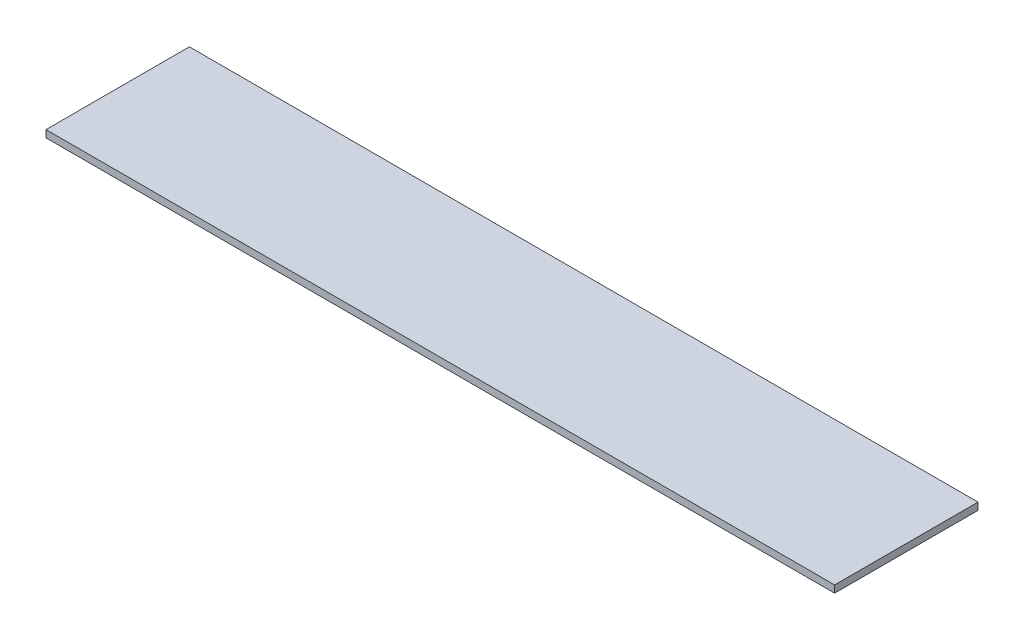
ISO-10303-21;
HEADER;
FILE_DESCRIPTION(('STEP AP214'),'2;1');
FILE_NAME('part.step','',(''),(''),'','','');
FILE_SCHEMA(('AUTOMOTIVE_DESIGN { 1 0 10303 214 1 1 1 1 }'));
ENDSEC;
DATA;
#1=APPLICATION_CONTEXT('core data for automotive mechanical design processes');
#2=APPLICATION_PROTOCOL_DEFINITION('international standard','automotive_design',2000,#1);
#3=PRODUCT_CONTEXT('',#1,'mechanical');
#4=PRODUCT('Part','Part','',(#3));
#5=PRODUCT_RELATED_PRODUCT_CATEGORY('part','',(#4));
#6=PRODUCT_DEFINITION_FORMATION('','',#4);
#7=PRODUCT_DEFINITION_CONTEXT('part definition',#1,'design');
#8=PRODUCT_DEFINITION('design','',#6,#7);
#9=PRODUCT_DEFINITION_SHAPE('','',#8);
#10=(LENGTH_UNIT() NAMED_UNIT(*) SI_UNIT(.MILLI.,.METRE.));
#11=(NAMED_UNIT(*) PLANE_ANGLE_UNIT() SI_UNIT($,.RADIAN.));
#12=(NAMED_UNIT(*) SI_UNIT($,.STERADIAN.) SOLID_ANGLE_UNIT());
#13=UNCERTAINTY_MEASURE_WITH_UNIT(LENGTH_MEASURE(1.E-05),#10,'distance_accuracy_value','');
#14=(GEOMETRIC_REPRESENTATION_CONTEXT(3) GLOBAL_UNCERTAINTY_ASSIGNED_CONTEXT((#13)) GLOBAL_UNIT_ASSIGNED_CONTEXT((#10,
#11,#12)) REPRESENTATION_CONTEXT('',''));
#15=CARTESIAN_POINT('',(0.,0.,0.));
#16=DIRECTION('',(0.,0.,1.));
#17=DIRECTION('',(1.,0.,0.));
#18=AXIS2_PLACEMENT_3D('',#15,#16,#17);
#19=CARTESIAN_POINT('',(0.,1.,0.));
#20=DIRECTION('',(1.,0.,0.));
#21=DIRECTION('',(0.,0.,-1.));
#22=AXIS2_PLACEMENT_3D('',#19,#20,#21);
#23=PLANE('',#22);
#24=DIRECTION('',(0.,0.,1.));
#25=VECTOR('',#24,1.);
#26=CARTESIAN_POINT('',(0.,0.,0.));
#27=LINE('',#26,#25);
#28=CARTESIAN_POINT('',(0.,0.,-20.));
#29=VERTEX_POINT('',#28);
#30=CARTESIAN_POINT('',(0.,0.,0.));
#31=VERTEX_POINT('',#30);
#32=EDGE_CURVE('E106',#29,#31,#27,.T.);
#33=ORIENTED_EDGE('',*,*,#32,.T.);
#34=DIRECTION('',(0.,-1.,0.));
#35=VECTOR('',#34,1.);
#36=CARTESIAN_POINT('',(0.,1.,0.));
#37=LINE('',#36,#35);
#38=CARTESIAN_POINT('',(0.,1.,0.));
#39=VERTEX_POINT('',#38);
#40=EDGE_CURVE('E11',#39,#31,#37,.T.);
#41=ORIENTED_EDGE('',*,*,#40,.F.);
#42=DIRECTION('',(0.,0.,1.));
#43=VECTOR('',#42,1.);
#44=CARTESIAN_POINT('',(0.,1.,0.));
#45=LINE('',#44,#43);
#46=CARTESIAN_POINT('',(0.,1.,-20.));
#47=VERTEX_POINT('',#46);
#48=EDGE_CURVE('E92',#47,#39,#45,.T.);
#49=ORIENTED_EDGE('',*,*,#48,.F.);
#50=DIRECTION('',(0.,-1.,0.));
#51=VECTOR('',#50,1.);
#52=CARTESIAN_POINT('',(0.,1.,-20.));
#53=LINE('',#52,#51);
#54=EDGE_CURVE('E105',#47,#29,#53,.T.);
#55=ORIENTED_EDGE('',*,*,#54,.T.);
#56=EDGE_LOOP('',(#33,#41,#49,#55));
#57=FACE_BOUND('',#56,.T.);
#58=ADVANCED_FACE('F43',(#57),#23,.F.);
#59=CARTESIAN_POINT('',(0.,1.,0.));
#60=DIRECTION('',(0.,0.,-1.));
#61=DIRECTION('',(-1.,0.,0.));
#62=AXIS2_PLACEMENT_3D('',#59,#60,#61);
#63=PLANE('',#62);
#64=DIRECTION('',(1.,0.,0.));
#65=VECTOR('',#64,1.);
#66=CARTESIAN_POINT('',(0.,0.,0.));
#67=LINE('',#66,#65);
#68=CARTESIAN_POINT('',(110.,0.,0.));
#69=VERTEX_POINT('',#68);
#70=EDGE_CURVE('E97',#31,#69,#67,.T.);
#71=ORIENTED_EDGE('',*,*,#70,.T.);
#72=DIRECTION('',(0.,-1.,0.));
#73=VECTOR('',#72,1.);
#74=CARTESIAN_POINT('',(110.,1.,0.));
#75=LINE('',#74,#73);
#76=CARTESIAN_POINT('',(110.,1.,0.));
#77=VERTEX_POINT('',#76);
#78=EDGE_CURVE('E51',#77,#69,#75,.T.);
#79=ORIENTED_EDGE('',*,*,#78,.F.);
#80=DIRECTION('',(1.,0.,0.));
#81=VECTOR('',#80,1.);
#82=CARTESIAN_POINT('',(0.,1.,0.));
#83=LINE('',#82,#81);
#84=EDGE_CURVE('E87',#39,#77,#83,.T.);
#85=ORIENTED_EDGE('',*,*,#84,.F.);
#86=ORIENTED_EDGE('',*,*,#40,.T.);
#87=EDGE_LOOP('',(#71,#79,#85,#86));
#88=FACE_BOUND('',#87,.T.);
#89=ADVANCED_FACE('F100',(#88),#63,.F.);
#90=CARTESIAN_POINT('',(110.,1.,0.));
#91=DIRECTION('',(-1.,0.,0.));
#92=DIRECTION('',(0.,0.,1.));
#93=AXIS2_PLACEMENT_3D('',#90,#91,#92);
#94=PLANE('',#93);
#95=DIRECTION('',(0.,0.,-1.));
#96=VECTOR('',#95,1.);
#97=CARTESIAN_POINT('',(110.,0.,0.));
#98=LINE('',#97,#96);
#99=CARTESIAN_POINT('',(110.,0.,-20.));
#100=VERTEX_POINT('',#99);
#101=EDGE_CURVE('E78',#69,#100,#98,.T.);
#102=ORIENTED_EDGE('',*,*,#101,.T.);
#103=DIRECTION('',(0.,-1.,0.));
#104=VECTOR('',#103,1.);
#105=CARTESIAN_POINT('',(110.,1.,-20.));
#106=LINE('',#105,#104);
#107=CARTESIAN_POINT('',(110.,1.,-20.));
#108=VERTEX_POINT('',#107);
#109=EDGE_CURVE('E98',#108,#100,#106,.T.);
#110=ORIENTED_EDGE('',*,*,#109,.F.);
#111=DIRECTION('',(0.,0.,-1.));
#112=VECTOR('',#111,1.);
#113=CARTESIAN_POINT('',(110.,1.,0.));
#114=LINE('',#113,#112);
#115=EDGE_CURVE('E95',#77,#108,#114,.T.);
#116=ORIENTED_EDGE('',*,*,#115,.F.);
#117=ORIENTED_EDGE('',*,*,#78,.T.);
#118=EDGE_LOOP('',(#102,#110,#116,#117));
#119=FACE_BOUND('',#118,.T.);
#120=ADVANCED_FACE('F99',(#119),#94,.F.);
#121=CARTESIAN_POINT('',(0.,1.,-20.));
#122=DIRECTION('',(0.,0.,1.));
#123=DIRECTION('',(1.,0.,0.));
#124=AXIS2_PLACEMENT_3D('',#121,#122,#123);
#125=PLANE('',#124);
#126=DIRECTION('',(-1.,0.,0.));
#127=VECTOR('',#126,1.);
#128=CARTESIAN_POINT('',(0.,0.,-20.));
#129=LINE('',#128,#127);
#130=EDGE_CURVE('E85',#100,#29,#129,.T.);
#131=ORIENTED_EDGE('',*,*,#130,.T.);
#132=ORIENTED_EDGE('',*,*,#54,.F.);
#133=DIRECTION('',(-1.,0.,0.));
#134=VECTOR('',#133,1.);
#135=CARTESIAN_POINT('',(0.,1.,-20.));
#136=LINE('',#135,#134);
#137=EDGE_CURVE('E56',#108,#47,#136,.T.);
#138=ORIENTED_EDGE('',*,*,#137,.F.);
#139=ORIENTED_EDGE('',*,*,#109,.T.);
#140=EDGE_LOOP('',(#131,#132,#138,#139));
#141=FACE_BOUND('',#140,.T.);
#142=ADVANCED_FACE('F111',(#141),#125,.F.);
#143=CARTESIAN_POINT('',(0.,1.,0.));
#144=DIRECTION('',(0.,-1.,0.));
#145=DIRECTION('',(0.,0.,-1.));
#146=AXIS2_PLACEMENT_3D('',#143,#144,#145);
#147=PLANE('',#146);
#148=ORIENTED_EDGE('',*,*,#48,.T.);
#149=ORIENTED_EDGE('',*,*,#84,.T.);
#150=ORIENTED_EDGE('',*,*,#115,.T.);
#151=ORIENTED_EDGE('',*,*,#137,.T.);
#152=EDGE_LOOP('',(#148,#149,#150,#151));
#153=FACE_BOUND('',#152,.T.);
#154=ADVANCED_FACE('F89',(#153),#147,.F.);
#155=CARTESIAN_POINT('',(0.,0.,0.));
#156=DIRECTION('',(0.,-1.,0.));
#157=DIRECTION('',(0.,0.,-1.));
#158=AXIS2_PLACEMENT_3D('',#155,#156,#157);
#159=PLANE('',#158);
#160=ORIENTED_EDGE('',*,*,#32,.F.);
#161=ORIENTED_EDGE('',*,*,#130,.F.);
#162=ORIENTED_EDGE('',*,*,#101,.F.);
#163=ORIENTED_EDGE('',*,*,#70,.F.);
#164=EDGE_LOOP('',(#160,#161,#162,#163));
#165=FACE_BOUND('',#164,.T.);
#166=ADVANCED_FACE('F116',(#165),#159,.T.);
#167=CLOSED_SHELL('',(#58,#89,#120,#142,#154,#166));
#168=MANIFOLD_SOLID_BREP('B2',#167);
#169=ADVANCED_BREP_SHAPE_REPRESENTATION('',(#18,#168),#14);
#170=SHAPE_DEFINITION_REPRESENTATION(#9,#169);
ENDSEC;
END-ISO-10303-21;
